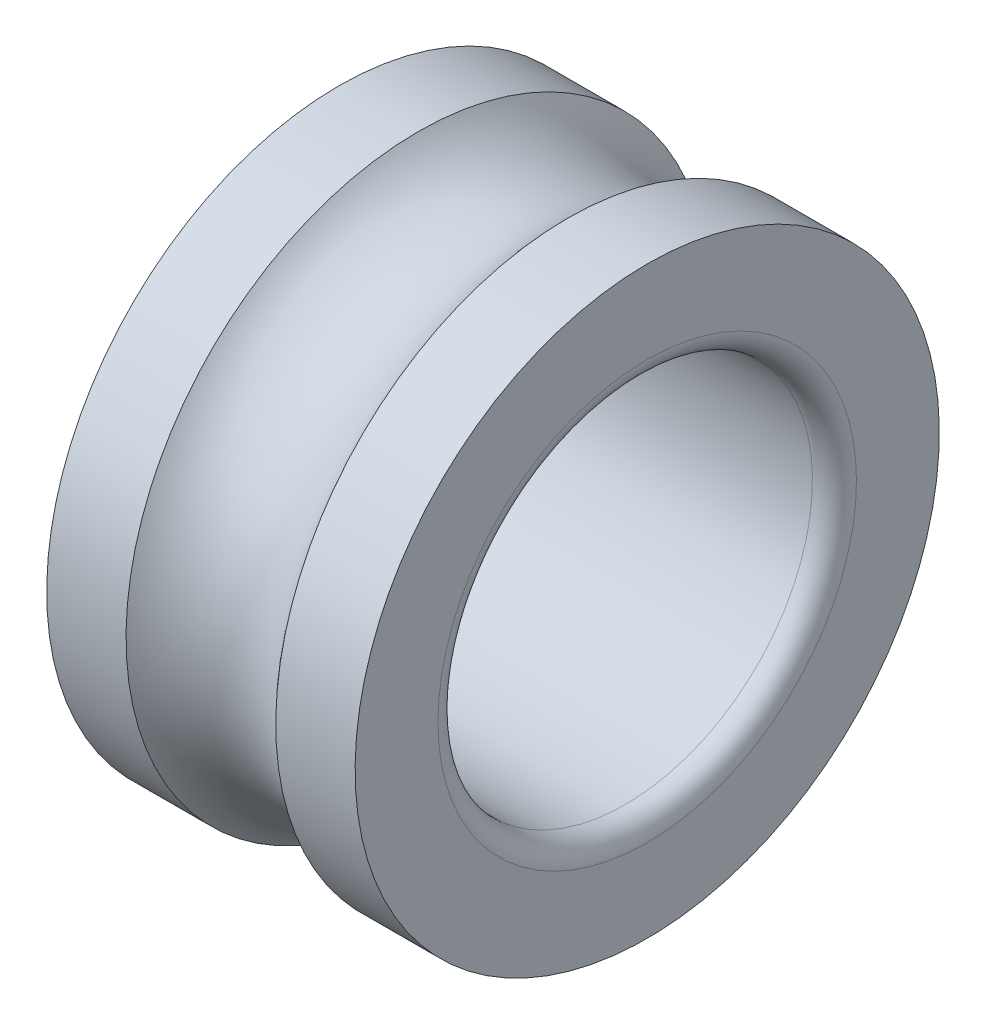
ISO-10303-21;
HEADER;
FILE_DESCRIPTION(('STEP AP214'),'2;1');
FILE_NAME('part.step','',(''),(''),'','','');
FILE_SCHEMA(('AUTOMOTIVE_DESIGN { 1 0 10303 214 1 1 1 1 }'));
ENDSEC;
DATA;
#1=APPLICATION_CONTEXT('core data for automotive mechanical design processes');
#2=APPLICATION_PROTOCOL_DEFINITION('international standard','automotive_design',2000,#1);
#3=PRODUCT_CONTEXT('',#1,'mechanical');
#4=PRODUCT('Part','Part','',(#3));
#5=PRODUCT_RELATED_PRODUCT_CATEGORY('part','',(#4));
#6=PRODUCT_DEFINITION_FORMATION('','',#4);
#7=PRODUCT_DEFINITION_CONTEXT('part definition',#1,'design');
#8=PRODUCT_DEFINITION('design','',#6,#7);
#9=PRODUCT_DEFINITION_SHAPE('','',#8);
#10=(LENGTH_UNIT() NAMED_UNIT(*) SI_UNIT(.MILLI.,.METRE.));
#11=(NAMED_UNIT(*) PLANE_ANGLE_UNIT() SI_UNIT($,.RADIAN.));
#12=(NAMED_UNIT(*) SI_UNIT($,.STERADIAN.) SOLID_ANGLE_UNIT());
#13=UNCERTAINTY_MEASURE_WITH_UNIT(LENGTH_MEASURE(1.E-05),#10,'distance_accuracy_value','');
#14=(GEOMETRIC_REPRESENTATION_CONTEXT(3) GLOBAL_UNCERTAINTY_ASSIGNED_CONTEXT((#13)) GLOBAL_UNIT_ASSIGNED_CONTEXT((#10,
#11,#12)) REPRESENTATION_CONTEXT('',''));
#15=CARTESIAN_POINT('',(0.,0.,0.));
#16=DIRECTION('',(0.,0.,1.));
#17=DIRECTION('',(1.,0.,0.));
#18=AXIS2_PLACEMENT_3D('',#15,#16,#17);
#19=CARTESIAN_POINT('',(12.1992638295744,0.,0.));
#20=DIRECTION('',(-1.,0.,0.));
#21=DIRECTION('',(0.,1.,0.));
#22=AXIS2_PLACEMENT_3D('',#19,#20,#21);
#23=CYLINDRICAL_SURFACE('',#22,13.26);
#24=CARTESIAN_POINT('',(10.3985276591489,0.,0.));
#25=DIRECTION('',(1.,0.,0.));
#26=DIRECTION('',(0.,1.,0.));
#27=AXIS2_PLACEMENT_3D('',#24,#25,#26);
#28=CIRCLE('',#27,13.26);
#29=CARTESIAN_POINT('',(10.3985276591489,13.26,0.));
#30=VERTEX_POINT('',#29);
#31=EDGE_CURVE('E11',#30,#30,#28,.T.);
#32=ORIENTED_EDGE('',*,*,#31,.T.);
#33=EDGE_LOOP('',(#32));
#34=FACE_BOUND('',#33,.T.);
#35=CARTESIAN_POINT('',(14.,0.,0.));
#36=DIRECTION('',(1.,0.,0.));
#37=DIRECTION('',(0.,1.,0.));
#38=AXIS2_PLACEMENT_3D('',#35,#36,#37);
#39=CIRCLE('',#38,13.26);
#40=CARTESIAN_POINT('',(14.,13.26,0.));
#41=VERTEX_POINT('',#40);
#42=EDGE_CURVE('E51',#41,#41,#39,.T.);
#43=ORIENTED_EDGE('',*,*,#42,.F.);
#44=EDGE_LOOP('',(#43));
#45=FACE_BOUND('',#44,.T.);
#46=ADVANCED_FACE('F16',(#34,#45),#23,.T.);
#47=CARTESIAN_POINT('',(7.,0.,0.));
#48=DIRECTION('',(1.,0.,0.));
#49=DIRECTION('',(0.,0.,-1.));
#50=AXIS2_PLACEMENT_3D('',#47,#48,#49);
#51=TOROIDAL_SURFACE('',#50,16.,4.3655);
#52=CARTESIAN_POINT('',(3.60147234085112,0.,0.));
#53=DIRECTION('',(1.,0.,0.));
#54=DIRECTION('',(0.,1.,0.));
#55=AXIS2_PLACEMENT_3D('',#52,#53,#54);
#56=CIRCLE('',#55,13.26);
#57=CARTESIAN_POINT('',(3.60147234085112,13.26,0.));
#58=VERTEX_POINT('',#57);
#59=EDGE_CURVE('E27',#58,#58,#56,.T.);
#60=ORIENTED_EDGE('',*,*,#59,.T.);
#61=EDGE_LOOP('',(#60));
#62=FACE_BOUND('',#61,.T.);
#63=ORIENTED_EDGE('',*,*,#31,.F.);
#64=EDGE_LOOP('',(#63));
#65=FACE_BOUND('',#64,.T.);
#66=ADVANCED_FACE('F72',(#62,#65),#51,.F.);
#67=CARTESIAN_POINT('',(1.80073617042556,0.,0.));
#68=DIRECTION('',(-1.,0.,0.));
#69=DIRECTION('',(0.,1.,0.));
#70=AXIS2_PLACEMENT_3D('',#67,#68,#69);
#71=CYLINDRICAL_SURFACE('',#70,13.26);
#72=CARTESIAN_POINT('',(0.,0.,0.));
#73=DIRECTION('',(1.,0.,0.));
#74=DIRECTION('',(0.,1.,0.));
#75=AXIS2_PLACEMENT_3D('',#72,#73,#74);
#76=CIRCLE('',#75,13.26);
#77=CARTESIAN_POINT('',(0.,13.26,0.));
#78=VERTEX_POINT('',#77);
#79=EDGE_CURVE('E62',#78,#78,#76,.T.);
#80=ORIENTED_EDGE('',*,*,#79,.T.);
#81=EDGE_LOOP('',(#80));
#82=FACE_BOUND('',#81,.T.);
#83=ORIENTED_EDGE('',*,*,#59,.F.);
#84=EDGE_LOOP('',(#83));
#85=FACE_BOUND('',#84,.T.);
#86=ADVANCED_FACE('F75',(#82,#85),#71,.T.);
#87=CARTESIAN_POINT('',(0.,11.38,0.));
#88=DIRECTION('',(-1.,0.,0.));
#89=DIRECTION('',(0.,-1.,0.));
#90=AXIS2_PLACEMENT_3D('',#87,#88,#89);
#91=PLANE('',#90);
#92=CARTESIAN_POINT('',(0.,0.,0.));
#93=DIRECTION('',(1.,0.,0.));
#94=DIRECTION('',(0.,1.,0.));
#95=AXIS2_PLACEMENT_3D('',#92,#93,#94);
#96=CIRCLE('',#95,9.5);
#97=CARTESIAN_POINT('',(0.,9.5,0.));
#98=VERTEX_POINT('',#97);
#99=EDGE_CURVE('E66',#98,#98,#96,.T.);
#100=ORIENTED_EDGE('',*,*,#99,.T.);
#101=EDGE_LOOP('',(#100));
#102=FACE_BOUND('',#101,.T.);
#103=ORIENTED_EDGE('',*,*,#79,.F.);
#104=EDGE_LOOP('',(#103));
#105=FACE_BOUND('',#104,.T.);
#106=ADVANCED_FACE('F77',(#102,#105),#91,.T.);
#107=CARTESIAN_POINT('',(1.,0.,0.));
#108=DIRECTION('',(1.,0.,0.));
#109=DIRECTION('',(0.,0.,-1.));
#110=AXIS2_PLACEMENT_3D('',#107,#108,#109);
#111=TOROIDAL_SURFACE('',#110,9.5,1.);
#112=CARTESIAN_POINT('',(1.,0.,0.));
#113=DIRECTION('',(1.,0.,0.));
#114=DIRECTION('',(0.,1.,0.));
#115=AXIS2_PLACEMENT_3D('',#112,#113,#114);
#116=CIRCLE('',#115,8.5);
#117=CARTESIAN_POINT('',(1.,8.5,0.));
#118=VERTEX_POINT('',#117);
#119=EDGE_CURVE('E20',#118,#118,#116,.T.);
#120=ORIENTED_EDGE('',*,*,#119,.T.);
#121=EDGE_LOOP('',(#120));
#122=FACE_BOUND('',#121,.T.);
#123=ORIENTED_EDGE('',*,*,#99,.F.);
#124=EDGE_LOOP('',(#123));
#125=FACE_BOUND('',#124,.T.);
#126=ADVANCED_FACE('F85',(#122,#125),#111,.T.);
#127=CARTESIAN_POINT('',(7.,0.,0.));
#128=DIRECTION('',(-1.,0.,0.));
#129=DIRECTION('',(0.,1.,0.));
#130=AXIS2_PLACEMENT_3D('',#127,#128,#129);
#131=CYLINDRICAL_SURFACE('',#130,8.5);
#132=CARTESIAN_POINT('',(13.,0.,0.));
#133=DIRECTION('',(1.,0.,0.));
#134=DIRECTION('',(0.,1.,0.));
#135=AXIS2_PLACEMENT_3D('',#132,#133,#134);
#136=CIRCLE('',#135,8.5);
#137=CARTESIAN_POINT('',(13.,8.5,0.));
#138=VERTEX_POINT('',#137);
#139=EDGE_CURVE('E56',#138,#138,#136,.T.);
#140=ORIENTED_EDGE('',*,*,#139,.T.);
#141=EDGE_LOOP('',(#140));
#142=FACE_BOUND('',#141,.T.);
#143=ORIENTED_EDGE('',*,*,#119,.F.);
#144=EDGE_LOOP('',(#143));
#145=FACE_BOUND('',#144,.T.);
#146=ADVANCED_FACE('F101',(#142,#145),#131,.F.);
#147=CARTESIAN_POINT('',(13.,0.,0.));
#148=DIRECTION('',(1.,0.,0.));
#149=DIRECTION('',(0.,0.,-1.));
#150=AXIS2_PLACEMENT_3D('',#147,#148,#149);
#151=TOROIDAL_SURFACE('',#150,9.5,1.);
#152=CARTESIAN_POINT('',(14.,0.,0.));
#153=DIRECTION('',(1.,0.,0.));
#154=DIRECTION('',(0.,1.,0.));
#155=AXIS2_PLACEMENT_3D('',#152,#153,#154);
#156=CIRCLE('',#155,9.5);
#157=CARTESIAN_POINT('',(14.,9.5,0.));
#158=VERTEX_POINT('',#157);
#159=EDGE_CURVE('E47',#158,#158,#156,.T.);
#160=ORIENTED_EDGE('',*,*,#159,.T.);
#161=EDGE_LOOP('',(#160));
#162=FACE_BOUND('',#161,.T.);
#163=ORIENTED_EDGE('',*,*,#139,.F.);
#164=EDGE_LOOP('',(#163));
#165=FACE_BOUND('',#164,.T.);
#166=ADVANCED_FACE('F18',(#162,#165),#151,.T.);
#167=CARTESIAN_POINT('',(14.,11.38,0.));
#168=DIRECTION('',(1.,0.,0.));
#169=DIRECTION('',(0.,1.,0.));
#170=AXIS2_PLACEMENT_3D('',#167,#168,#169);
#171=PLANE('',#170);
#172=ORIENTED_EDGE('',*,*,#42,.T.);
#173=EDGE_LOOP('',(#172));
#174=FACE_BOUND('',#173,.T.);
#175=ORIENTED_EDGE('',*,*,#159,.F.);
#176=EDGE_LOOP('',(#175));
#177=FACE_BOUND('',#176,.T.);
#178=ADVANCED_FACE('F95',(#174,#177),#171,.T.);
#179=CLOSED_SHELL('',(#46,#66,#86,#106,#126,#146,#166,#178));
#180=MANIFOLD_SOLID_BREP('B1',#179);
#181=ADVANCED_BREP_SHAPE_REPRESENTATION('',(#18,#180),#14);
#182=SHAPE_DEFINITION_REPRESENTATION(#9,#181);
ENDSEC;
END-ISO-10303-21;
